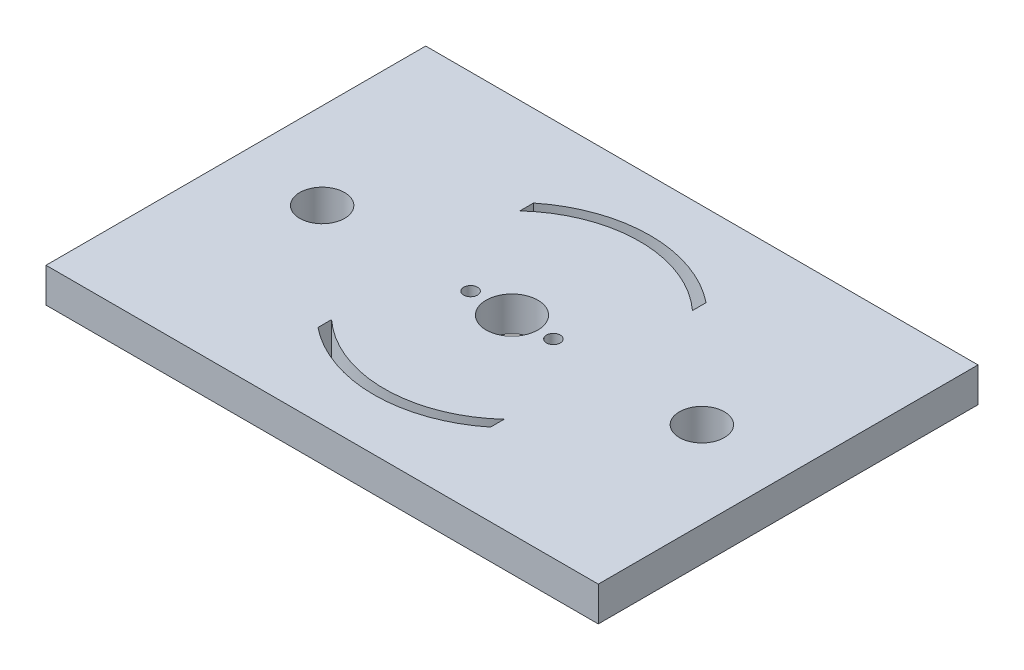
ISO-10303-21;
HEADER;
FILE_DESCRIPTION(('STEP AP214'),'2;1');
FILE_NAME('part.step','',(''),(''),'','','');
FILE_SCHEMA(('AUTOMOTIVE_DESIGN { 1 0 10303 214 1 1 1 1 }'));
ENDSEC;
DATA;
#1=APPLICATION_CONTEXT('core data for automotive mechanical design processes');
#2=APPLICATION_PROTOCOL_DEFINITION('international standard','automotive_design',2000,#1);
#3=PRODUCT_CONTEXT('',#1,'mechanical');
#4=PRODUCT('Part','Part','',(#3));
#5=PRODUCT_RELATED_PRODUCT_CATEGORY('part','',(#4));
#6=PRODUCT_DEFINITION_FORMATION('','',#4);
#7=PRODUCT_DEFINITION_CONTEXT('part definition',#1,'design');
#8=PRODUCT_DEFINITION('design','',#6,#7);
#9=PRODUCT_DEFINITION_SHAPE('','',#8);
#10=(LENGTH_UNIT() NAMED_UNIT(*) SI_UNIT(.MILLI.,.METRE.));
#11=(NAMED_UNIT(*) PLANE_ANGLE_UNIT() SI_UNIT($,.RADIAN.));
#12=(NAMED_UNIT(*) SI_UNIT($,.STERADIAN.) SOLID_ANGLE_UNIT());
#13=UNCERTAINTY_MEASURE_WITH_UNIT(LENGTH_MEASURE(1.E-05),#10,'distance_accuracy_value','');
#14=(GEOMETRIC_REPRESENTATION_CONTEXT(3) GLOBAL_UNCERTAINTY_ASSIGNED_CONTEXT((#13)) GLOBAL_UNIT_ASSIGNED_CONTEXT((#10,
#11,#12)) REPRESENTATION_CONTEXT('',''));
#15=CARTESIAN_POINT('',(0.,0.,0.));
#16=DIRECTION('',(0.,0.,1.));
#17=DIRECTION('',(1.,0.,0.));
#18=AXIS2_PLACEMENT_3D('',#15,#16,#17);
#19=CARTESIAN_POINT('',(0.,10.,0.));
#20=DIRECTION('',(0.,1.,0.));
#21=DIRECTION('',(0.,0.,1.));
#22=AXIS2_PLACEMENT_3D('',#19,#20,#21);
#23=PLANE('',#22);
#24=CARTESIAN_POINT('',(-12.,10.,0.));
#25=DIRECTION('',(0.,1.,0.));
#26=DIRECTION('',(0.,0.,1.));
#27=AXIS2_PLACEMENT_3D('',#24,#25,#26);
#28=CIRCLE('',#27,2.);
#29=CARTESIAN_POINT('',(-12.,10.,2.));
#30=VERTEX_POINT('',#29);
#31=EDGE_CURVE('E342',#30,#30,#28,.T.);
#32=ORIENTED_EDGE('',*,*,#31,.F.);
#33=EDGE_LOOP('',(#32));
#34=FACE_BOUND('',#33,.T.);
#35=CARTESIAN_POINT('',(12.0000000000001,10.,0.));
#36=DIRECTION('',(0.,1.,0.));
#37=DIRECTION('',(0.,0.,-1.));
#38=AXIS2_PLACEMENT_3D('',#35,#36,#37);
#39=CIRCLE('',#38,2.);
#40=CARTESIAN_POINT('',(12.0000000000001,10.,-2.));
#41=VERTEX_POINT('',#40);
#42=EDGE_CURVE('E345',#41,#41,#39,.T.);
#43=ORIENTED_EDGE('',*,*,#42,.F.);
#44=EDGE_LOOP('',(#43));
#45=FACE_BOUND('',#44,.T.);
#46=DIRECTION('',(0.,0.,-1.));
#47=VECTOR('',#46,1.);
#48=CARTESIAN_POINT('',(25.,10.,27.2763633939718));
#49=LINE('',#48,#47);
#50=CARTESIAN_POINT('',(25.,10.,31.224989991992));
#51=VERTEX_POINT('',#50);
#52=CARTESIAN_POINT('',(25.,10.,27.2763633939718));
#53=VERTEX_POINT('',#52);
#54=EDGE_CURVE('E138',#51,#53,#49,.T.);
#55=ORIENTED_EDGE('',*,*,#54,.F.);
#56=CARTESIAN_POINT('',(0.,10.,0.));
#57=DIRECTION('',(0.,1.,0.));
#58=DIRECTION('',(0.,0.,1.));
#59=AXIS2_PLACEMENT_3D('',#56,#57,#58);
#60=CIRCLE('',#59,40.);
#61=CARTESIAN_POINT('',(-25.,10.,31.224989991992));
#62=VERTEX_POINT('',#61);
#63=EDGE_CURVE('E129',#62,#51,#60,.T.);
#64=ORIENTED_EDGE('',*,*,#63,.F.);
#65=DIRECTION('',(0.,0.,1.));
#66=VECTOR('',#65,1.);
#67=CARTESIAN_POINT('',(-25.,10.,27.2763633939717));
#68=LINE('',#67,#66);
#69=CARTESIAN_POINT('',(-25.,10.,27.2763633939717));
#70=VERTEX_POINT('',#69);
#71=EDGE_CURVE('E156',#70,#62,#68,.T.);
#72=ORIENTED_EDGE('',*,*,#71,.F.);
#73=CARTESIAN_POINT('',(0.,10.,0.));
#74=DIRECTION('',(0.,-1.,0.));
#75=DIRECTION('',(0.,0.,1.));
#76=AXIS2_PLACEMENT_3D('',#73,#74,#75);
#77=CIRCLE('',#76,37.);
#78=EDGE_CURVE('E152',#53,#70,#77,.T.);
#79=ORIENTED_EDGE('',*,*,#78,.F.);
#80=EDGE_LOOP('',(#55,#64,#72,#79));
#81=FACE_BOUND('',#80,.T.);
#82=CARTESIAN_POINT('',(0.,10.,0.));
#83=DIRECTION('',(0.,1.,0.));
#84=DIRECTION('',(0.,0.,1.));
#85=AXIS2_PLACEMENT_3D('',#82,#83,#84);
#86=CIRCLE('',#85,7.5);
#87=CARTESIAN_POINT('',(0.,10.,7.5));
#88=VERTEX_POINT('',#87);
#89=EDGE_CURVE('E180',#88,#88,#86,.T.);
#90=ORIENTED_EDGE('',*,*,#89,.F.);
#91=EDGE_LOOP('',(#90));
#92=FACE_BOUND('',#91,.T.);
#93=DIRECTION('',(0.,0.,-1.));
#94=VECTOR('',#93,1.);
#95=CARTESIAN_POINT('',(80.,10.,-55.));
#96=LINE('',#95,#94);
#97=CARTESIAN_POINT('',(80.,10.,55.));
#98=VERTEX_POINT('',#97);
#99=CARTESIAN_POINT('',(80.,10.,-55.));
#100=VERTEX_POINT('',#99);
#101=EDGE_CURVE('E239',#98,#100,#96,.T.);
#102=ORIENTED_EDGE('',*,*,#101,.T.);
#103=DIRECTION('',(-1.,0.,0.));
#104=VECTOR('',#103,1.);
#105=CARTESIAN_POINT('',(-80.,10.,-55.));
#106=LINE('',#105,#104);
#107=CARTESIAN_POINT('',(-80.,10.,-55.));
#108=VERTEX_POINT('',#107);
#109=EDGE_CURVE('E243',#100,#108,#106,.T.);
#110=ORIENTED_EDGE('',*,*,#109,.T.);
#111=DIRECTION('',(0.,0.,1.));
#112=VECTOR('',#111,1.);
#113=CARTESIAN_POINT('',(-80.,10.,-55.));
#114=LINE('',#113,#112);
#115=CARTESIAN_POINT('',(-80.0000000000001,10.,55.));
#116=VERTEX_POINT('',#115);
#117=EDGE_CURVE('E247',#108,#116,#114,.T.);
#118=ORIENTED_EDGE('',*,*,#117,.T.);
#119=DIRECTION('',(1.,0.,0.));
#120=VECTOR('',#119,1.);
#121=CARTESIAN_POINT('',(-80.0000000000001,10.,55.));
#122=LINE('',#121,#120);
#123=EDGE_CURVE('E250',#116,#98,#122,.T.);
#124=ORIENTED_EDGE('',*,*,#123,.T.);
#125=EDGE_LOOP('',(#102,#110,#118,#124));
#126=FACE_BOUND('',#125,.T.);
#127=CARTESIAN_POINT('',(-55.,10.,0.));
#128=DIRECTION('',(0.,1.,0.));
#129=DIRECTION('',(0.,0.,1.));
#130=AXIS2_PLACEMENT_3D('',#127,#128,#129);
#131=CIRCLE('',#130,6.5);
#132=CARTESIAN_POINT('',(-55.,10.,6.5));
#133=VERTEX_POINT('',#132);
#134=EDGE_CURVE('E231',#133,#133,#131,.T.);
#135=ORIENTED_EDGE('',*,*,#134,.F.);
#136=EDGE_LOOP('',(#135));
#137=FACE_BOUND('',#136,.T.);
#138=DIRECTION('',(0.,0.,1.));
#139=VECTOR('',#138,1.);
#140=CARTESIAN_POINT('',(-25.,10.,-31.224989991992));
#141=LINE('',#140,#139);
#142=CARTESIAN_POINT('',(-25.,10.,-31.224989991992));
#143=VERTEX_POINT('',#142);
#144=CARTESIAN_POINT('',(-25.,10.,-27.2763633939717));
#145=VERTEX_POINT('',#144);
#146=EDGE_CURVE('E191',#143,#145,#141,.T.);
#147=ORIENTED_EDGE('',*,*,#146,.F.);
#148=CARTESIAN_POINT('',(0.,10.,0.));
#149=DIRECTION('',(0.,1.,0.));
#150=DIRECTION('',(0.,0.,1.));
#151=AXIS2_PLACEMENT_3D('',#148,#149,#150);
#152=CIRCLE('',#151,40.);
#153=CARTESIAN_POINT('',(25.,10.,-31.224989991992));
#154=VERTEX_POINT('',#153);
#155=EDGE_CURVE('E188',#154,#143,#152,.T.);
#156=ORIENTED_EDGE('',*,*,#155,.F.);
#157=DIRECTION('',(0.,0.,-1.));
#158=VECTOR('',#157,1.);
#159=CARTESIAN_POINT('',(25.,10.,-31.224989991992));
#160=LINE('',#159,#158);
#161=CARTESIAN_POINT('',(25.,10.,-27.2763633939718));
#162=VERTEX_POINT('',#161);
#163=EDGE_CURVE('E199',#162,#154,#160,.T.);
#164=ORIENTED_EDGE('',*,*,#163,.F.);
#165=CARTESIAN_POINT('',(0.,10.,0.));
#166=DIRECTION('',(0.,-1.,0.));
#167=DIRECTION('',(0.,0.,1.));
#168=AXIS2_PLACEMENT_3D('',#165,#166,#167);
#169=CIRCLE('',#168,37.);
#170=EDGE_CURVE('E195',#145,#162,#169,.T.);
#171=ORIENTED_EDGE('',*,*,#170,.F.);
#172=EDGE_LOOP('',(#147,#156,#164,#171));
#173=FACE_BOUND('',#172,.T.);
#174=CARTESIAN_POINT('',(55.,10.,0.));
#175=DIRECTION('',(0.,1.,0.));
#176=DIRECTION('',(0.,0.,-1.));
#177=AXIS2_PLACEMENT_3D('',#174,#175,#176);
#178=CIRCLE('',#177,6.5);
#179=CARTESIAN_POINT('',(55.,10.,-6.5));
#180=VERTEX_POINT('',#179);
#181=EDGE_CURVE('E164',#180,#180,#178,.T.);
#182=ORIENTED_EDGE('',*,*,#181,.F.);
#183=EDGE_LOOP('',(#182));
#184=FACE_BOUND('',#183,.T.);
#185=ADVANCED_FACE('F39',(#34,#45,#81,#92,#126,#137,#173,#184),#23,.T.);
#186=CARTESIAN_POINT('',(0.,0.,0.));
#187=DIRECTION('',(0.,1.,0.));
#188=DIRECTION('',(0.,0.,1.));
#189=AXIS2_PLACEMENT_3D('',#186,#187,#188);
#190=PLANE('',#189);
#191=CARTESIAN_POINT('',(0.,0.,0.));
#192=DIRECTION('',(0.,1.,0.));
#193=DIRECTION('',(0.,0.,1.));
#194=AXIS2_PLACEMENT_3D('',#191,#192,#193);
#195=CIRCLE('',#194,7.5);
#196=CARTESIAN_POINT('',(0.,0.,7.5));
#197=VERTEX_POINT('',#196);
#198=EDGE_CURVE('E147',#197,#197,#195,.T.);
#199=ORIENTED_EDGE('',*,*,#198,.T.);
#200=EDGE_LOOP('',(#199));
#201=FACE_BOUND('',#200,.T.);
#202=CARTESIAN_POINT('',(0.,0.,0.));
#203=DIRECTION('',(0.,1.,0.));
#204=DIRECTION('',(0.,0.,1.));
#205=AXIS2_PLACEMENT_3D('',#202,#203,#204);
#206=CIRCLE('',#205,40.);
#207=CARTESIAN_POINT('',(25.,0.,-31.224989991992));
#208=VERTEX_POINT('',#207);
#209=CARTESIAN_POINT('',(-25.,0.,-31.224989991992));
#210=VERTEX_POINT('',#209);
#211=EDGE_CURVE('E184',#208,#210,#206,.T.);
#212=ORIENTED_EDGE('',*,*,#211,.T.);
#213=DIRECTION('',(0.,0.,1.));
#214=VECTOR('',#213,1.);
#215=CARTESIAN_POINT('',(-25.,0.,-31.224989991992));
#216=LINE('',#215,#214);
#217=CARTESIAN_POINT('',(-25.,0.,-27.2763633939717));
#218=VERTEX_POINT('',#217);
#219=EDGE_CURVE('E206',#210,#218,#216,.T.);
#220=ORIENTED_EDGE('',*,*,#219,.T.);
#221=CARTESIAN_POINT('',(0.,0.,0.));
#222=DIRECTION('',(0.,-1.,0.));
#223=DIRECTION('',(0.,0.,1.));
#224=AXIS2_PLACEMENT_3D('',#221,#222,#223);
#225=CIRCLE('',#224,37.);
#226=CARTESIAN_POINT('',(25.,0.,-27.2763633939718));
#227=VERTEX_POINT('',#226);
#228=EDGE_CURVE('E210',#218,#227,#225,.T.);
#229=ORIENTED_EDGE('',*,*,#228,.T.);
#230=DIRECTION('',(0.,0.,-1.));
#231=VECTOR('',#230,1.);
#232=CARTESIAN_POINT('',(25.,0.,-31.224989991992));
#233=LINE('',#232,#231);
#234=EDGE_CURVE('E192',#227,#208,#233,.T.);
#235=ORIENTED_EDGE('',*,*,#234,.T.);
#236=EDGE_LOOP('',(#212,#220,#229,#235));
#237=FACE_BOUND('',#236,.T.);
#238=DIRECTION('',(0.,0.,-1.));
#239=VECTOR('',#238,1.);
#240=CARTESIAN_POINT('',(80.,0.,-55.));
#241=LINE('',#240,#239);
#242=CARTESIAN_POINT('',(80.,0.,55.));
#243=VERTEX_POINT('',#242);
#244=CARTESIAN_POINT('',(80.,0.,-55.));
#245=VERTEX_POINT('',#244);
#246=EDGE_CURVE('E235',#243,#245,#241,.T.);
#247=ORIENTED_EDGE('',*,*,#246,.F.);
#248=DIRECTION('',(1.,0.,0.));
#249=VECTOR('',#248,1.);
#250=CARTESIAN_POINT('',(-80.0000000000001,0.,55.));
#251=LINE('',#250,#249);
#252=CARTESIAN_POINT('',(-80.0000000000001,0.,55.));
#253=VERTEX_POINT('',#252);
#254=EDGE_CURVE('E244',#253,#243,#251,.T.);
#255=ORIENTED_EDGE('',*,*,#254,.F.);
#256=DIRECTION('',(0.,0.,1.));
#257=VECTOR('',#256,1.);
#258=CARTESIAN_POINT('',(-80.,0.,-55.));
#259=LINE('',#258,#257);
#260=CARTESIAN_POINT('',(-80.,0.,-55.));
#261=VERTEX_POINT('',#260);
#262=EDGE_CURVE('E260',#261,#253,#259,.T.);
#263=ORIENTED_EDGE('',*,*,#262,.F.);
#264=DIRECTION('',(-1.,0.,0.));
#265=VECTOR('',#264,1.);
#266=CARTESIAN_POINT('',(-80.,0.,-55.));
#267=LINE('',#266,#265);
#268=EDGE_CURVE('E257',#245,#261,#267,.T.);
#269=ORIENTED_EDGE('',*,*,#268,.F.);
#270=EDGE_LOOP('',(#247,#255,#263,#269));
#271=FACE_BOUND('',#270,.T.);
#272=CARTESIAN_POINT('',(-55.,0.,0.));
#273=DIRECTION('',(0.,1.,0.));
#274=DIRECTION('',(0.,0.,1.));
#275=AXIS2_PLACEMENT_3D('',#272,#273,#274);
#276=CIRCLE('',#275,6.5);
#277=CARTESIAN_POINT('',(-55.,0.,6.5));
#278=VERTEX_POINT('',#277);
#279=EDGE_CURVE('E230',#278,#278,#276,.T.);
#280=ORIENTED_EDGE('',*,*,#279,.T.);
#281=EDGE_LOOP('',(#280));
#282=FACE_BOUND('',#281,.T.);
#283=CARTESIAN_POINT('',(0.,0.,0.));
#284=DIRECTION('',(0.,1.,0.));
#285=DIRECTION('',(0.,0.,1.));
#286=AXIS2_PLACEMENT_3D('',#283,#284,#285);
#287=CIRCLE('',#286,40.);
#288=CARTESIAN_POINT('',(-25.,0.,31.224989991992));
#289=VERTEX_POINT('',#288);
#290=CARTESIAN_POINT('',(25.,0.,31.224989991992));
#291=VERTEX_POINT('',#290);
#292=EDGE_CURVE('E63',#289,#291,#287,.T.);
#293=ORIENTED_EDGE('',*,*,#292,.T.);
#294=DIRECTION('',(0.,0.,-1.));
#295=VECTOR('',#294,1.);
#296=CARTESIAN_POINT('',(25.,0.,27.2763633939718));
#297=LINE('',#296,#295);
#298=CARTESIAN_POINT('',(25.,0.,27.2763633939718));
#299=VERTEX_POINT('',#298);
#300=EDGE_CURVE('E145',#291,#299,#297,.T.);
#301=ORIENTED_EDGE('',*,*,#300,.T.);
#302=CARTESIAN_POINT('',(0.,0.,0.));
#303=DIRECTION('',(0.,-1.,0.));
#304=DIRECTION('',(0.,0.,1.));
#305=AXIS2_PLACEMENT_3D('',#302,#303,#304);
#306=CIRCLE('',#305,37.);
#307=CARTESIAN_POINT('',(-25.,0.,27.2763633939717));
#308=VERTEX_POINT('',#307);
#309=EDGE_CURVE('E167',#299,#308,#306,.T.);
#310=ORIENTED_EDGE('',*,*,#309,.T.);
#311=DIRECTION('',(0.,0.,1.));
#312=VECTOR('',#311,1.);
#313=CARTESIAN_POINT('',(-25.,0.,27.2763633939717));
#314=LINE('',#313,#312);
#315=EDGE_CURVE('E139',#308,#289,#314,.T.);
#316=ORIENTED_EDGE('',*,*,#315,.T.);
#317=EDGE_LOOP('',(#293,#301,#310,#316));
#318=FACE_BOUND('',#317,.T.);
#319=CARTESIAN_POINT('',(55.,0.,0.));
#320=DIRECTION('',(0.,1.,0.));
#321=DIRECTION('',(0.,0.,-1.));
#322=AXIS2_PLACEMENT_3D('',#319,#320,#321);
#323=CIRCLE('',#322,6.5);
#324=CARTESIAN_POINT('',(55.,0.,-6.5));
#325=VERTEX_POINT('',#324);
#326=EDGE_CURVE('E333',#325,#325,#323,.T.);
#327=ORIENTED_EDGE('',*,*,#326,.T.);
#328=EDGE_LOOP('',(#327));
#329=FACE_BOUND('',#328,.T.);
#330=ADVANCED_FACE('F283',(#201,#237,#271,#282,#318,#329),#190,.F.);
#331=CARTESIAN_POINT('',(80.,10.,-55.));
#332=DIRECTION('',(-1.,0.,0.));
#333=DIRECTION('',(0.,0.,1.));
#334=AXIS2_PLACEMENT_3D('',#331,#332,#333);
#335=PLANE('',#334);
#336=ORIENTED_EDGE('',*,*,#246,.T.);
#337=DIRECTION('',(0.,-1.,0.));
#338=VECTOR('',#337,1.);
#339=CARTESIAN_POINT('',(80.,10.,-55.));
#340=LINE('',#339,#338);
#341=EDGE_CURVE('E11',#100,#245,#340,.T.);
#342=ORIENTED_EDGE('',*,*,#341,.F.);
#343=ORIENTED_EDGE('',*,*,#101,.F.);
#344=DIRECTION('',(0.,-1.,0.));
#345=VECTOR('',#344,1.);
#346=CARTESIAN_POINT('',(80.,10.,55.));
#347=LINE('',#346,#345);
#348=EDGE_CURVE('E253',#98,#243,#347,.T.);
#349=ORIENTED_EDGE('',*,*,#348,.T.);
#350=EDGE_LOOP('',(#336,#342,#343,#349));
#351=FACE_BOUND('',#350,.T.);
#352=ADVANCED_FACE('F41',(#351),#335,.F.);
#353=CARTESIAN_POINT('',(-80.,10.,-55.));
#354=DIRECTION('',(0.,0.,1.));
#355=DIRECTION('',(1.,0.,0.));
#356=AXIS2_PLACEMENT_3D('',#353,#354,#355);
#357=PLANE('',#356);
#358=ORIENTED_EDGE('',*,*,#268,.T.);
#359=DIRECTION('',(0.,-1.,0.));
#360=VECTOR('',#359,1.);
#361=CARTESIAN_POINT('',(-80.,10.,-55.));
#362=LINE('',#361,#360);
#363=EDGE_CURVE('E48',#108,#261,#362,.T.);
#364=ORIENTED_EDGE('',*,*,#363,.F.);
#365=ORIENTED_EDGE('',*,*,#109,.F.);
#366=ORIENTED_EDGE('',*,*,#341,.T.);
#367=EDGE_LOOP('',(#358,#364,#365,#366));
#368=FACE_BOUND('',#367,.T.);
#369=ADVANCED_FACE('F294',(#368),#357,.F.);
#370=CARTESIAN_POINT('',(-80.,10.,-55.));
#371=DIRECTION('',(1.,0.,0.));
#372=DIRECTION('',(0.,0.,-1.));
#373=AXIS2_PLACEMENT_3D('',#370,#371,#372);
#374=PLANE('',#373);
#375=ORIENTED_EDGE('',*,*,#262,.T.);
#376=DIRECTION('',(0.,-1.,0.));
#377=VECTOR('',#376,1.);
#378=CARTESIAN_POINT('',(-80.0000000000001,10.,55.));
#379=LINE('',#378,#377);
#380=EDGE_CURVE('E268',#116,#253,#379,.T.);
#381=ORIENTED_EDGE('',*,*,#380,.F.);
#382=ORIENTED_EDGE('',*,*,#117,.F.);
#383=ORIENTED_EDGE('',*,*,#363,.T.);
#384=EDGE_LOOP('',(#375,#381,#382,#383));
#385=FACE_BOUND('',#384,.T.);
#386=ADVANCED_FACE('F277',(#385),#374,.F.);
#387=CARTESIAN_POINT('',(-80.0000000000001,10.,55.));
#388=DIRECTION('',(0.,0.,-1.));
#389=DIRECTION('',(-1.,0.,0.));
#390=AXIS2_PLACEMENT_3D('',#387,#388,#389);
#391=PLANE('',#390);
#392=ORIENTED_EDGE('',*,*,#254,.T.);
#393=ORIENTED_EDGE('',*,*,#348,.F.);
#394=ORIENTED_EDGE('',*,*,#123,.F.);
#395=ORIENTED_EDGE('',*,*,#380,.T.);
#396=EDGE_LOOP('',(#392,#393,#394,#395));
#397=FACE_BOUND('',#396,.T.);
#398=ADVANCED_FACE('F287',(#397),#391,.F.);
#399=CARTESIAN_POINT('',(-55.,10.,0.));
#400=DIRECTION('',(0.,-1.,0.));
#401=DIRECTION('',(0.,0.,-1.));
#402=AXIS2_PLACEMENT_3D('',#399,#400,#401);
#403=CYLINDRICAL_SURFACE('',#402,6.5);
#404=ORIENTED_EDGE('',*,*,#134,.T.);
#405=EDGE_LOOP('',(#404));
#406=FACE_BOUND('',#405,.T.);
#407=ORIENTED_EDGE('',*,*,#279,.F.);
#408=EDGE_LOOP('',(#407));
#409=FACE_BOUND('',#408,.T.);
#410=ADVANCED_FACE('F312',(#406,#409),#403,.F.);
#411=CARTESIAN_POINT('',(0.,10.,0.));
#412=DIRECTION('',(0.,-1.,0.));
#413=DIRECTION('',(0.,0.,-1.));
#414=AXIS2_PLACEMENT_3D('',#411,#412,#413);
#415=CYLINDRICAL_SURFACE('',#414,40.);
#416=ORIENTED_EDGE('',*,*,#211,.F.);
#417=DIRECTION('',(0.,-1.,0.));
#418=VECTOR('',#417,1.);
#419=CARTESIAN_POINT('',(25.,10.,-31.224989991992));
#420=LINE('',#419,#418);
#421=EDGE_CURVE('E202',#154,#208,#420,.T.);
#422=ORIENTED_EDGE('',*,*,#421,.F.);
#423=ORIENTED_EDGE('',*,*,#155,.T.);
#424=DIRECTION('',(0.,-1.,0.));
#425=VECTOR('',#424,1.);
#426=CARTESIAN_POINT('',(-25.,10.,-31.224989991992));
#427=LINE('',#426,#425);
#428=EDGE_CURVE('E226',#143,#210,#427,.T.);
#429=ORIENTED_EDGE('',*,*,#428,.T.);
#430=EDGE_LOOP('',(#416,#422,#423,#429));
#431=FACE_BOUND('',#430,.T.);
#432=ADVANCED_FACE('F319',(#431),#415,.F.);
#433=CARTESIAN_POINT('',(-25.,10.,-31.224989991992));
#434=DIRECTION('',(1.,0.,0.));
#435=DIRECTION('',(0.,0.,-1.));
#436=AXIS2_PLACEMENT_3D('',#433,#434,#435);
#437=PLANE('',#436);
#438=ORIENTED_EDGE('',*,*,#219,.F.);
#439=ORIENTED_EDGE('',*,*,#428,.F.);
#440=ORIENTED_EDGE('',*,*,#146,.T.);
#441=DIRECTION('',(0.,-1.,0.));
#442=VECTOR('',#441,1.);
#443=CARTESIAN_POINT('',(-25.,10.,-27.2763633939717));
#444=LINE('',#443,#442);
#445=EDGE_CURVE('E223',#145,#218,#444,.T.);
#446=ORIENTED_EDGE('',*,*,#445,.T.);
#447=EDGE_LOOP('',(#438,#439,#440,#446));
#448=FACE_BOUND('',#447,.T.);
#449=ADVANCED_FACE('F324',(#448),#437,.T.);
#450=CARTESIAN_POINT('',(0.,10.,0.));
#451=DIRECTION('',(0.,-1.,0.));
#452=DIRECTION('',(0.,0.,-1.));
#453=AXIS2_PLACEMENT_3D('',#450,#451,#452);
#454=CYLINDRICAL_SURFACE('',#453,37.);
#455=ORIENTED_EDGE('',*,*,#228,.F.);
#456=ORIENTED_EDGE('',*,*,#445,.F.);
#457=ORIENTED_EDGE('',*,*,#170,.T.);
#458=DIRECTION('',(0.,-1.,0.));
#459=VECTOR('',#458,1.);
#460=CARTESIAN_POINT('',(25.,10.,-27.2763633939718));
#461=LINE('',#460,#459);
#462=EDGE_CURVE('E220',#162,#227,#461,.T.);
#463=ORIENTED_EDGE('',*,*,#462,.T.);
#464=EDGE_LOOP('',(#455,#456,#457,#463));
#465=FACE_BOUND('',#464,.T.);
#466=ADVANCED_FACE('F398',(#465),#454,.T.);
#467=CARTESIAN_POINT('',(25.,10.,-31.224989991992));
#468=DIRECTION('',(-1.,0.,0.));
#469=DIRECTION('',(0.,0.,1.));
#470=AXIS2_PLACEMENT_3D('',#467,#468,#469);
#471=PLANE('',#470);
#472=ORIENTED_EDGE('',*,*,#234,.F.);
#473=ORIENTED_EDGE('',*,*,#462,.F.);
#474=ORIENTED_EDGE('',*,*,#163,.T.);
#475=ORIENTED_EDGE('',*,*,#421,.T.);
#476=EDGE_LOOP('',(#472,#473,#474,#475));
#477=FACE_BOUND('',#476,.T.);
#478=ADVANCED_FACE('F394',(#477),#471,.T.);
#479=CARTESIAN_POINT('',(0.,10.,0.));
#480=DIRECTION('',(0.,-1.,0.));
#481=DIRECTION('',(0.,0.,-1.));
#482=AXIS2_PLACEMENT_3D('',#479,#480,#481);
#483=CYLINDRICAL_SURFACE('',#482,7.5);
#484=ORIENTED_EDGE('',*,*,#89,.T.);
#485=EDGE_LOOP('',(#484));
#486=FACE_BOUND('',#485,.T.);
#487=ORIENTED_EDGE('',*,*,#198,.F.);
#488=EDGE_LOOP('',(#487));
#489=FACE_BOUND('',#488,.T.);
#490=ADVANCED_FACE('F391',(#486,#489),#483,.F.);
#491=CARTESIAN_POINT('',(0.,10.,0.));
#492=DIRECTION('',(0.,-1.,0.));
#493=DIRECTION('',(0.,0.,-1.));
#494=AXIS2_PLACEMENT_3D('',#491,#492,#493);
#495=CYLINDRICAL_SURFACE('',#494,40.);
#496=ORIENTED_EDGE('',*,*,#292,.F.);
#497=DIRECTION('',(0.,-1.,0.));
#498=VECTOR('',#497,1.);
#499=CARTESIAN_POINT('',(-25.,10.,31.224989991992));
#500=LINE('',#499,#498);
#501=EDGE_CURVE('E133',#62,#289,#500,.T.);
#502=ORIENTED_EDGE('',*,*,#501,.F.);
#503=ORIENTED_EDGE('',*,*,#63,.T.);
#504=DIRECTION('',(0.,-1.,0.));
#505=VECTOR('',#504,1.);
#506=CARTESIAN_POINT('',(25.,10.,31.224989991992));
#507=LINE('',#506,#505);
#508=EDGE_CURVE('E132',#51,#291,#507,.T.);
#509=ORIENTED_EDGE('',*,*,#508,.T.);
#510=EDGE_LOOP('',(#496,#502,#503,#509));
#511=FACE_BOUND('',#510,.T.);
#512=ADVANCED_FACE('F131',(#511),#495,.F.);
#513=CARTESIAN_POINT('',(25.,10.,27.2763633939718));
#514=DIRECTION('',(-1.,0.,0.));
#515=DIRECTION('',(0.,0.,1.));
#516=AXIS2_PLACEMENT_3D('',#513,#514,#515);
#517=PLANE('',#516);
#518=ORIENTED_EDGE('',*,*,#300,.F.);
#519=ORIENTED_EDGE('',*,*,#508,.F.);
#520=ORIENTED_EDGE('',*,*,#54,.T.);
#521=DIRECTION('',(0.,-1.,0.));
#522=VECTOR('',#521,1.);
#523=CARTESIAN_POINT('',(25.,10.,27.2763633939718));
#524=LINE('',#523,#522);
#525=EDGE_CURVE('E148',#53,#299,#524,.T.);
#526=ORIENTED_EDGE('',*,*,#525,.T.);
#527=EDGE_LOOP('',(#518,#519,#520,#526));
#528=FACE_BOUND('',#527,.T.);
#529=ADVANCED_FACE('F142',(#528),#517,.T.);
#530=CARTESIAN_POINT('',(0.,10.,0.));
#531=DIRECTION('',(0.,-1.,0.));
#532=DIRECTION('',(0.,0.,-1.));
#533=AXIS2_PLACEMENT_3D('',#530,#531,#532);
#534=CYLINDRICAL_SURFACE('',#533,37.);
#535=ORIENTED_EDGE('',*,*,#309,.F.);
#536=ORIENTED_EDGE('',*,*,#525,.F.);
#537=ORIENTED_EDGE('',*,*,#78,.T.);
#538=DIRECTION('',(0.,-1.,0.));
#539=VECTOR('',#538,1.);
#540=CARTESIAN_POINT('',(-25.,10.,27.2763633939717));
#541=LINE('',#540,#539);
#542=EDGE_CURVE('E55',#70,#308,#541,.T.);
#543=ORIENTED_EDGE('',*,*,#542,.T.);
#544=EDGE_LOOP('',(#535,#536,#537,#543));
#545=FACE_BOUND('',#544,.T.);
#546=ADVANCED_FACE('F383',(#545),#534,.T.);
#547=CARTESIAN_POINT('',(-25.,10.,27.2763633939717));
#548=DIRECTION('',(1.,0.,0.));
#549=DIRECTION('',(0.,0.,-1.));
#550=AXIS2_PLACEMENT_3D('',#547,#548,#549);
#551=PLANE('',#550);
#552=ORIENTED_EDGE('',*,*,#315,.F.);
#553=ORIENTED_EDGE('',*,*,#542,.F.);
#554=ORIENTED_EDGE('',*,*,#71,.T.);
#555=ORIENTED_EDGE('',*,*,#501,.T.);
#556=EDGE_LOOP('',(#552,#553,#554,#555));
#557=FACE_BOUND('',#556,.T.);
#558=ADVANCED_FACE('F379',(#557),#551,.T.);
#559=CARTESIAN_POINT('',(55.,10.,0.));
#560=DIRECTION('',(0.,-1.,0.));
#561=DIRECTION('',(0.,0.,-1.));
#562=AXIS2_PLACEMENT_3D('',#559,#560,#561);
#563=CYLINDRICAL_SURFACE('',#562,6.5);
#564=ORIENTED_EDGE('',*,*,#181,.T.);
#565=EDGE_LOOP('',(#564));
#566=FACE_BOUND('',#565,.T.);
#567=ORIENTED_EDGE('',*,*,#326,.F.);
#568=EDGE_LOOP('',(#567));
#569=FACE_BOUND('',#568,.T.);
#570=ADVANCED_FACE('F375',(#566,#569),#563,.F.);
#571=CARTESIAN_POINT('',(12.0000000000001,5.,0.));
#572=DIRECTION('',(0.,1.,0.));
#573=DIRECTION('',(0.,0.,1.));
#574=AXIS2_PLACEMENT_3D('',#571,#572,#573);
#575=CYLINDRICAL_SURFACE('',#574,2.);
#576=CARTESIAN_POINT('',(12.0000000000001,5.,0.));
#577=DIRECTION('',(0.,1.,0.));
#578=DIRECTION('',(0.,0.,-1.));
#579=AXIS2_PLACEMENT_3D('',#576,#577,#578);
#580=CIRCLE('',#579,2.);
#581=CARTESIAN_POINT('',(12.0000000000001,5.,-2.));
#582=VERTEX_POINT('',#581);
#583=EDGE_CURVE('E349',#582,#582,#580,.T.);
#584=ORIENTED_EDGE('',*,*,#583,.F.);
#585=EDGE_LOOP('',(#584));
#586=FACE_BOUND('',#585,.T.);
#587=ORIENTED_EDGE('',*,*,#42,.T.);
#588=EDGE_LOOP('',(#587));
#589=FACE_BOUND('',#588,.T.);
#590=ADVANCED_FACE('F368',(#586,#589),#575,.F.);
#591=CARTESIAN_POINT('',(12.0000000000001,5.,0.));
#592=DIRECTION('',(0.,-1.,0.));
#593=DIRECTION('',(0.,0.,-1.));
#594=AXIS2_PLACEMENT_3D('',#591,#592,#593);
#595=PLANE('',#594);
#596=ORIENTED_EDGE('',*,*,#583,.T.);
#597=EDGE_LOOP('',(#596));
#598=FACE_BOUND('',#597,.T.);
#599=ADVANCED_FACE('F359',(#598),#595,.F.);
#600=CARTESIAN_POINT('',(-12.,5.,0.));
#601=DIRECTION('',(0.,1.,0.));
#602=DIRECTION('',(0.,0.,1.));
#603=AXIS2_PLACEMENT_3D('',#600,#601,#602);
#604=CYLINDRICAL_SURFACE('',#603,2.);
#605=CARTESIAN_POINT('',(-12.,5.,0.));
#606=DIRECTION('',(0.,1.,0.));
#607=DIRECTION('',(0.,0.,1.));
#608=AXIS2_PLACEMENT_3D('',#605,#606,#607);
#609=CIRCLE('',#608,2.);
#610=CARTESIAN_POINT('',(-12.,5.,2.));
#611=VERTEX_POINT('',#610);
#612=EDGE_CURVE('E336',#611,#611,#609,.T.);
#613=ORIENTED_EDGE('',*,*,#612,.F.);
#614=EDGE_LOOP('',(#613));
#615=FACE_BOUND('',#614,.T.);
#616=ORIENTED_EDGE('',*,*,#31,.T.);
#617=EDGE_LOOP('',(#616));
#618=FACE_BOUND('',#617,.T.);
#619=ADVANCED_FACE('F356',(#615,#618),#604,.F.);
#620=CARTESIAN_POINT('',(-12.,5.,0.));
#621=DIRECTION('',(0.,1.,0.));
#622=DIRECTION('',(0.,0.,1.));
#623=AXIS2_PLACEMENT_3D('',#620,#621,#622);
#624=PLANE('',#623);
#625=ORIENTED_EDGE('',*,*,#612,.T.);
#626=EDGE_LOOP('',(#625));
#627=FACE_BOUND('',#626,.T.);
#628=ADVANCED_FACE('F358',(#627),#624,.T.);
#629=CLOSED_SHELL('',(#185,#330,#352,#369,#386,#398,#410,#432,#449,#466,#478,#490,#512,#529,
#546,#558,#570,#590,#599,#619,#628));
#630=MANIFOLD_SOLID_BREP('B2',#629);
#631=ADVANCED_BREP_SHAPE_REPRESENTATION('',(#18,#630),#14);
#632=SHAPE_DEFINITION_REPRESENTATION(#9,#631);
ENDSEC;
END-ISO-10303-21;
